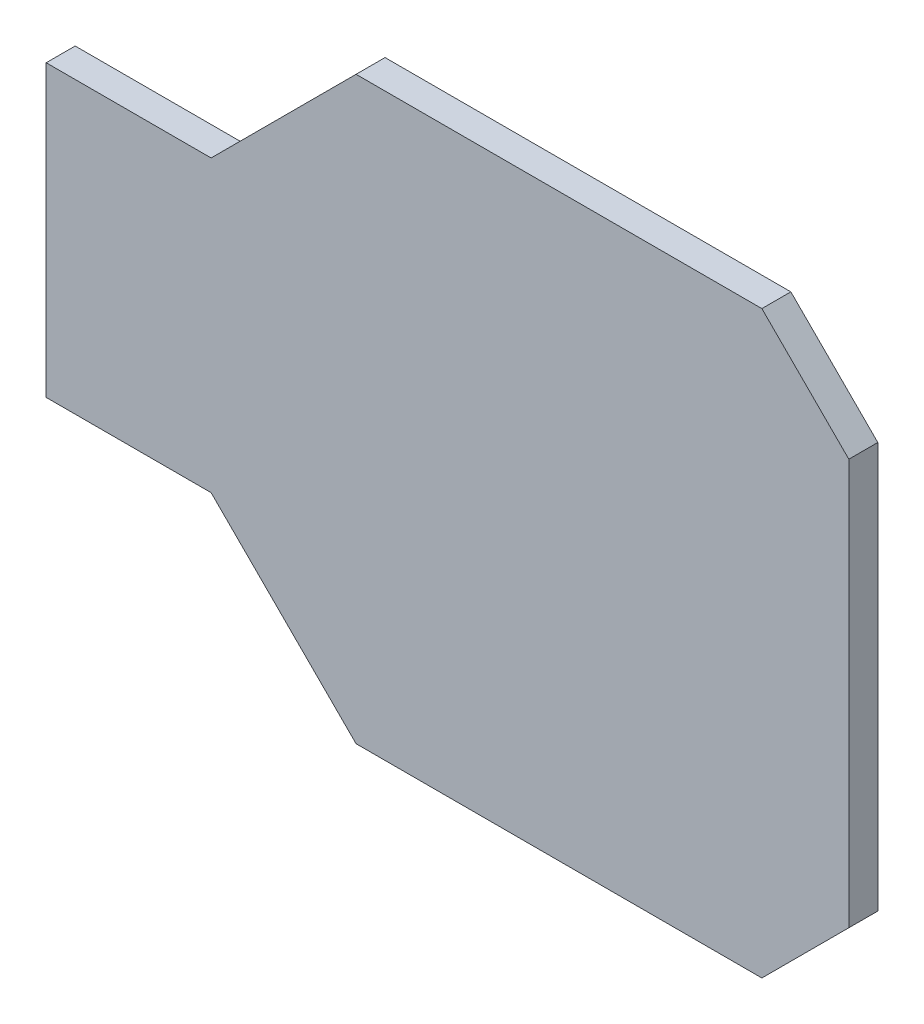
ISO-10303-21;
HEADER;
FILE_DESCRIPTION(('STEP AP214'),'2;1');
FILE_NAME('part.step','',(''),(''),'','','');
FILE_SCHEMA(('AUTOMOTIVE_DESIGN { 1 0 10303 214 1 1 1 1 }'));
ENDSEC;
DATA;
#1=APPLICATION_CONTEXT('core data for automotive mechanical design processes');
#2=APPLICATION_PROTOCOL_DEFINITION('international standard','automotive_design',2000,#1);
#3=PRODUCT_CONTEXT('',#1,'mechanical');
#4=PRODUCT('Part','Part','',(#3));
#5=PRODUCT_RELATED_PRODUCT_CATEGORY('part','',(#4));
#6=PRODUCT_DEFINITION_FORMATION('','',#4);
#7=PRODUCT_DEFINITION_CONTEXT('part definition',#1,'design');
#8=PRODUCT_DEFINITION('design','',#6,#7);
#9=PRODUCT_DEFINITION_SHAPE('','',#8);
#10=(LENGTH_UNIT() NAMED_UNIT(*) SI_UNIT(.MILLI.,.METRE.));
#11=(NAMED_UNIT(*) PLANE_ANGLE_UNIT() SI_UNIT($,.RADIAN.));
#12=(NAMED_UNIT(*) SI_UNIT($,.STERADIAN.) SOLID_ANGLE_UNIT());
#13=UNCERTAINTY_MEASURE_WITH_UNIT(LENGTH_MEASURE(1.E-05),#10,'distance_accuracy_value','');
#14=(GEOMETRIC_REPRESENTATION_CONTEXT(3) GLOBAL_UNCERTAINTY_ASSIGNED_CONTEXT((#13)) GLOBAL_UNIT_ASSIGNED_CONTEXT((#10,
#11,#12)) REPRESENTATION_CONTEXT('',''));
#15=CARTESIAN_POINT('',(0.,0.,0.));
#16=DIRECTION('',(0.,0.,1.));
#17=DIRECTION('',(1.,0.,0.));
#18=AXIS2_PLACEMENT_3D('',#15,#16,#17);
#19=CARTESIAN_POINT('',(0.,0.,0.1016));
#20=DIRECTION('',(0.,0.,1.));
#21=DIRECTION('',(1.,0.,0.));
#22=AXIS2_PLACEMENT_3D('',#19,#20,#21);
#23=PLANE('',#22);
#24=DIRECTION('',(1.,0.,0.));
#25=VECTOR('',#24,1.);
#26=CARTESIAN_POINT('',(0.677926,0.254,0.1016));
#27=LINE('',#26,#25);
#28=CARTESIAN_POINT('',(0.322326,0.254,0.1016));
#29=VERTEX_POINT('',#28);
#30=CARTESIAN_POINT('',(0.677926,0.254,0.1016));
#31=VERTEX_POINT('',#30);
#32=EDGE_CURVE('E106',#29,#31,#27,.T.);
#33=ORIENTED_EDGE('',*,*,#32,.F.);
#34=DIRECTION('',(-0.707106781186548,-0.707106781186548,0.));
#35=VECTOR('',#34,1.);
#36=CARTESIAN_POINT('',(0.322326,0.254,0.1016));
#37=LINE('',#36,#35);
#38=CARTESIAN_POINT('',(0.195326,0.127,0.1016));
#39=VERTEX_POINT('',#38);
#40=EDGE_CURVE('E20',#39,#29,#37,.F.);
#41=ORIENTED_EDGE('',*,*,#40,.F.);
#42=DIRECTION('',(1.,0.,0.));
#43=VECTOR('',#42,1.);
#44=CARTESIAN_POINT('',(0.195326,0.127,0.1016));
#45=LINE('',#44,#43);
#46=CARTESIAN_POINT('',(0.0508,0.127,0.1016));
#47=VERTEX_POINT('',#46);
#48=EDGE_CURVE('E95',#47,#39,#45,.T.);
#49=ORIENTED_EDGE('',*,*,#48,.F.);
#50=DIRECTION('',(0.,1.,0.));
#51=VECTOR('',#50,1.);
#52=CARTESIAN_POINT('',(0.0508,0.127,0.1016));
#53=LINE('',#52,#51);
#54=CARTESIAN_POINT('',(0.0508,-0.127,0.1016));
#55=VERTEX_POINT('',#54);
#56=EDGE_CURVE('E90',#55,#47,#53,.T.);
#57=ORIENTED_EDGE('',*,*,#56,.F.);
#58=DIRECTION('',(1.,0.,0.));
#59=VECTOR('',#58,1.);
#60=CARTESIAN_POINT('',(0.0508,-0.127,0.1016));
#61=LINE('',#60,#59);
#62=CARTESIAN_POINT('',(0.195326,-0.127,0.1016));
#63=VERTEX_POINT('',#62);
#64=EDGE_CURVE('E117',#63,#55,#61,.F.);
#65=ORIENTED_EDGE('',*,*,#64,.F.);
#66=DIRECTION('',(0.707106781186548,-0.707106781186548,0.));
#67=VECTOR('',#66,1.);
#68=CARTESIAN_POINT('',(0.195326,-0.127,0.1016));
#69=LINE('',#68,#67);
#70=CARTESIAN_POINT('',(0.322326,-0.254,0.1016));
#71=VERTEX_POINT('',#70);
#72=EDGE_CURVE('E121',#71,#63,#69,.F.);
#73=ORIENTED_EDGE('',*,*,#72,.F.);
#74=DIRECTION('',(1.,0.,0.));
#75=VECTOR('',#74,1.);
#76=CARTESIAN_POINT('',(0.322326,-0.254,0.1016));
#77=LINE('',#76,#75);
#78=CARTESIAN_POINT('',(0.677926,-0.254,0.1016));
#79=VERTEX_POINT('',#78);
#80=EDGE_CURVE('E125',#79,#71,#77,.F.);
#81=ORIENTED_EDGE('',*,*,#80,.F.);
#82=DIRECTION('',(0.707106781186548,0.707106781186548,0.));
#83=VECTOR('',#82,1.);
#84=CARTESIAN_POINT('',(0.677926,-0.254,0.1016));
#85=LINE('',#84,#83);
#86=CARTESIAN_POINT('',(0.754126,-0.1778,0.1016));
#87=VERTEX_POINT('',#86);
#88=EDGE_CURVE('E129',#87,#79,#85,.F.);
#89=ORIENTED_EDGE('',*,*,#88,.F.);
#90=DIRECTION('',(0.,1.,0.));
#91=VECTOR('',#90,1.);
#92=CARTESIAN_POINT('',(0.754126,-0.1778,0.1016));
#93=LINE('',#92,#91);
#94=CARTESIAN_POINT('',(0.754126,0.1778,0.1016));
#95=VERTEX_POINT('',#94);
#96=EDGE_CURVE('E133',#95,#87,#93,.F.);
#97=ORIENTED_EDGE('',*,*,#96,.F.);
#98=DIRECTION('',(-0.707106781186548,0.707106781186548,0.));
#99=VECTOR('',#98,1.);
#100=CARTESIAN_POINT('',(0.754126,0.1778,0.1016));
#101=LINE('',#100,#99);
#102=EDGE_CURVE('E137',#31,#95,#101,.F.);
#103=ORIENTED_EDGE('',*,*,#102,.F.);
#104=EDGE_LOOP('',(#33,#41,#49,#57,#65,#73,#81,#89,#97,#103));
#105=FACE_BOUND('',#104,.T.);
#106=ADVANCED_FACE('F17',(#105),#23,.T.);
#107=CARTESIAN_POINT('',(0.322326,0.254,0.0762));
#108=DIRECTION('',(-0.707106781186548,0.707106781186548,0.));
#109=DIRECTION('',(-0.707106781186548,-0.707106781186548,0.));
#110=AXIS2_PLACEMENT_3D('',#107,#108,#109);
#111=PLANE('',#110);
#112=DIRECTION('',(0.,0.,1.));
#113=VECTOR('',#112,1.);
#114=CARTESIAN_POINT('',(0.322326,0.254,0.0762));
#115=LINE('',#114,#113);
#116=CARTESIAN_POINT('',(0.322326,0.254,0.0762));
#117=VERTEX_POINT('',#116);
#118=EDGE_CURVE('E141',#117,#29,#115,.T.);
#119=ORIENTED_EDGE('',*,*,#118,.F.);
#120=DIRECTION('',(-0.707106781186548,-0.707106781186547,0.));
#121=VECTOR('',#120,1.);
#122=CARTESIAN_POINT('',(0.322326,0.254,0.0762));
#123=LINE('',#122,#121);
#124=CARTESIAN_POINT('',(0.195326,0.127,0.0762));
#125=VERTEX_POINT('',#124);
#126=EDGE_CURVE('E112',#117,#125,#123,.T.);
#127=ORIENTED_EDGE('',*,*,#126,.T.);
#128=DIRECTION('',(0.,0.,1.));
#129=VECTOR('',#128,1.);
#130=CARTESIAN_POINT('',(0.195326,0.127,0.0762));
#131=LINE('',#130,#129);
#132=EDGE_CURVE('E100',#39,#125,#131,.F.);
#133=ORIENTED_EDGE('',*,*,#132,.F.);
#134=ORIENTED_EDGE('',*,*,#40,.T.);
#135=EDGE_LOOP('',(#119,#127,#133,#134));
#136=FACE_BOUND('',#135,.T.);
#137=ADVANCED_FACE('F111',(#136),#111,.T.);
#138=CARTESIAN_POINT('',(0.195326,0.127,0.0762));
#139=DIRECTION('',(0.,1.,0.));
#140=DIRECTION('',(0.,0.,1.));
#141=AXIS2_PLACEMENT_3D('',#138,#139,#140);
#142=PLANE('',#141);
#143=ORIENTED_EDGE('',*,*,#132,.T.);
#144=DIRECTION('',(1.,0.,0.));
#145=VECTOR('',#144,1.);
#146=CARTESIAN_POINT('',(0.,0.127,0.0762));
#147=LINE('',#146,#145);
#148=CARTESIAN_POINT('',(0.0508,0.127,0.0762));
#149=VERTEX_POINT('',#148);
#150=EDGE_CURVE('E146',#125,#149,#147,.F.);
#151=ORIENTED_EDGE('',*,*,#150,.T.);
#152=DIRECTION('',(0.,0.,1.));
#153=VECTOR('',#152,1.);
#154=CARTESIAN_POINT('',(0.0508,0.127,0.0762));
#155=LINE('',#154,#153);
#156=EDGE_CURVE('E102',#47,#149,#155,.F.);
#157=ORIENTED_EDGE('',*,*,#156,.F.);
#158=ORIENTED_EDGE('',*,*,#48,.T.);
#159=EDGE_LOOP('',(#143,#151,#157,#158));
#160=FACE_BOUND('',#159,.T.);
#161=ADVANCED_FACE('F97',(#160),#142,.T.);
#162=CARTESIAN_POINT('',(0.0508,0.127,0.0762));
#163=DIRECTION('',(-1.,0.,0.));
#164=DIRECTION('',(0.,0.,1.));
#165=AXIS2_PLACEMENT_3D('',#162,#163,#164);
#166=PLANE('',#165);
#167=ORIENTED_EDGE('',*,*,#156,.T.);
#168=DIRECTION('',(0.,1.,0.));
#169=VECTOR('',#168,1.);
#170=CARTESIAN_POINT('',(0.0508,0.,0.0762));
#171=LINE('',#170,#169);
#172=CARTESIAN_POINT('',(0.0508,-0.127,0.0762));
#173=VERTEX_POINT('',#172);
#174=EDGE_CURVE('E148',#149,#173,#171,.F.);
#175=ORIENTED_EDGE('',*,*,#174,.T.);
#176=DIRECTION('',(0.,0.,-1.));
#177=VECTOR('',#176,1.);
#178=CARTESIAN_POINT('',(0.0508,-0.127,0.0762));
#179=LINE('',#178,#177);
#180=EDGE_CURVE('E119',#55,#173,#179,.T.);
#181=ORIENTED_EDGE('',*,*,#180,.F.);
#182=ORIENTED_EDGE('',*,*,#56,.T.);
#183=EDGE_LOOP('',(#167,#175,#181,#182));
#184=FACE_BOUND('',#183,.T.);
#185=ADVANCED_FACE('F198',(#184),#166,.T.);
#186=CARTESIAN_POINT('',(0.0508,-0.127,0.0762));
#187=DIRECTION('',(0.,-1.,0.));
#188=DIRECTION('',(0.,0.,-1.));
#189=AXIS2_PLACEMENT_3D('',#186,#187,#188);
#190=PLANE('',#189);
#191=ORIENTED_EDGE('',*,*,#180,.T.);
#192=DIRECTION('',(1.,0.,0.));
#193=VECTOR('',#192,1.);
#194=CARTESIAN_POINT('',(0.,-0.127,0.0762));
#195=LINE('',#194,#193);
#196=CARTESIAN_POINT('',(0.195326,-0.127,0.0762));
#197=VERTEX_POINT('',#196);
#198=EDGE_CURVE('E151',#173,#197,#195,.T.);
#199=ORIENTED_EDGE('',*,*,#198,.T.);
#200=DIRECTION('',(0.,0.,1.));
#201=VECTOR('',#200,1.);
#202=CARTESIAN_POINT('',(0.195326,-0.127,0.0762));
#203=LINE('',#202,#201);
#204=EDGE_CURVE('E123',#63,#197,#203,.F.);
#205=ORIENTED_EDGE('',*,*,#204,.F.);
#206=ORIENTED_EDGE('',*,*,#64,.T.);
#207=EDGE_LOOP('',(#191,#199,#205,#206));
#208=FACE_BOUND('',#207,.T.);
#209=ADVANCED_FACE('F197',(#208),#190,.T.);
#210=CARTESIAN_POINT('',(0.195326,-0.127,0.0762));
#211=DIRECTION('',(-0.707106781186548,-0.707106781186548,0.));
#212=DIRECTION('',(0.707106781186548,-0.707106781186548,0.));
#213=AXIS2_PLACEMENT_3D('',#210,#211,#212);
#214=PLANE('',#213);
#215=ORIENTED_EDGE('',*,*,#204,.T.);
#216=DIRECTION('',(0.707106781186548,-0.707106781186547,0.));
#217=VECTOR('',#216,1.);
#218=CARTESIAN_POINT('',(0.195326,-0.127,0.0762));
#219=LINE('',#218,#217);
#220=CARTESIAN_POINT('',(0.322326,-0.254,0.0762));
#221=VERTEX_POINT('',#220);
#222=EDGE_CURVE('E154',#197,#221,#219,.T.);
#223=ORIENTED_EDGE('',*,*,#222,.T.);
#224=DIRECTION('',(0.,0.,-1.));
#225=VECTOR('',#224,1.);
#226=CARTESIAN_POINT('',(0.322326,-0.254,0.0762));
#227=LINE('',#226,#225);
#228=EDGE_CURVE('E127',#71,#221,#227,.T.);
#229=ORIENTED_EDGE('',*,*,#228,.F.);
#230=ORIENTED_EDGE('',*,*,#72,.T.);
#231=EDGE_LOOP('',(#215,#223,#229,#230));
#232=FACE_BOUND('',#231,.T.);
#233=ADVANCED_FACE('F191',(#232),#214,.T.);
#234=CARTESIAN_POINT('',(0.322326,-0.254,0.0762));
#235=DIRECTION('',(0.,-1.,0.));
#236=DIRECTION('',(0.,0.,-1.));
#237=AXIS2_PLACEMENT_3D('',#234,#235,#236);
#238=PLANE('',#237);
#239=ORIENTED_EDGE('',*,*,#228,.T.);
#240=DIRECTION('',(1.,0.,0.));
#241=VECTOR('',#240,1.);
#242=CARTESIAN_POINT('',(0.,-0.254,0.0762));
#243=LINE('',#242,#241);
#244=CARTESIAN_POINT('',(0.677926,-0.254,0.0762));
#245=VERTEX_POINT('',#244);
#246=EDGE_CURVE('E157',#221,#245,#243,.T.);
#247=ORIENTED_EDGE('',*,*,#246,.T.);
#248=DIRECTION('',(0.,0.,1.));
#249=VECTOR('',#248,1.);
#250=CARTESIAN_POINT('',(0.677926,-0.254,0.0762));
#251=LINE('',#250,#249);
#252=EDGE_CURVE('E131',#79,#245,#251,.F.);
#253=ORIENTED_EDGE('',*,*,#252,.F.);
#254=ORIENTED_EDGE('',*,*,#80,.T.);
#255=EDGE_LOOP('',(#239,#247,#253,#254));
#256=FACE_BOUND('',#255,.T.);
#257=ADVANCED_FACE('F187',(#256),#238,.T.);
#258=CARTESIAN_POINT('',(0.677926,-0.254,0.0762));
#259=DIRECTION('',(0.707106781186548,-0.707106781186548,0.));
#260=DIRECTION('',(0.707106781186548,0.707106781186548,0.));
#261=AXIS2_PLACEMENT_3D('',#258,#259,#260);
#262=PLANE('',#261);
#263=ORIENTED_EDGE('',*,*,#252,.T.);
#264=DIRECTION('',(0.707106781186548,0.707106781186547,0.));
#265=VECTOR('',#264,1.);
#266=CARTESIAN_POINT('',(0.677926,-0.254,0.0762));
#267=LINE('',#266,#265);
#268=CARTESIAN_POINT('',(0.754126,-0.1778,0.0762));
#269=VERTEX_POINT('',#268);
#270=EDGE_CURVE('E160',#245,#269,#267,.T.);
#271=ORIENTED_EDGE('',*,*,#270,.T.);
#272=DIRECTION('',(0.,0.,-1.));
#273=VECTOR('',#272,1.);
#274=CARTESIAN_POINT('',(0.754126,-0.1778,0.0762));
#275=LINE('',#274,#273);
#276=EDGE_CURVE('E135',#87,#269,#275,.T.);
#277=ORIENTED_EDGE('',*,*,#276,.F.);
#278=ORIENTED_EDGE('',*,*,#88,.T.);
#279=EDGE_LOOP('',(#263,#271,#277,#278));
#280=FACE_BOUND('',#279,.T.);
#281=ADVANCED_FACE('F181',(#280),#262,.T.);
#282=CARTESIAN_POINT('',(0.754126,-0.1778,0.0762));
#283=DIRECTION('',(1.,0.,0.));
#284=DIRECTION('',(0.,0.,-1.));
#285=AXIS2_PLACEMENT_3D('',#282,#283,#284);
#286=PLANE('',#285);
#287=ORIENTED_EDGE('',*,*,#276,.T.);
#288=DIRECTION('',(0.,1.,0.));
#289=VECTOR('',#288,1.);
#290=CARTESIAN_POINT('',(0.754126,0.,0.0762));
#291=LINE('',#290,#289);
#292=CARTESIAN_POINT('',(0.754126,0.1778,0.0762));
#293=VERTEX_POINT('',#292);
#294=EDGE_CURVE('E163',#269,#293,#291,.T.);
#295=ORIENTED_EDGE('',*,*,#294,.T.);
#296=DIRECTION('',(0.,0.,1.));
#297=VECTOR('',#296,1.);
#298=CARTESIAN_POINT('',(0.754126,0.1778,0.0762));
#299=LINE('',#298,#297);
#300=EDGE_CURVE('E139',#95,#293,#299,.F.);
#301=ORIENTED_EDGE('',*,*,#300,.F.);
#302=ORIENTED_EDGE('',*,*,#96,.T.);
#303=EDGE_LOOP('',(#287,#295,#301,#302));
#304=FACE_BOUND('',#303,.T.);
#305=ADVANCED_FACE('F176',(#304),#286,.T.);
#306=CARTESIAN_POINT('',(0.754126,0.1778,0.0762));
#307=DIRECTION('',(0.707106781186548,0.707106781186548,0.));
#308=DIRECTION('',(-0.707106781186548,0.707106781186548,0.));
#309=AXIS2_PLACEMENT_3D('',#306,#307,#308);
#310=PLANE('',#309);
#311=ORIENTED_EDGE('',*,*,#300,.T.);
#312=DIRECTION('',(-0.707106781186548,0.707106781186547,0.));
#313=VECTOR('',#312,1.);
#314=CARTESIAN_POINT('',(0.754126,0.1778,0.0762));
#315=LINE('',#314,#313);
#316=CARTESIAN_POINT('',(0.677926,0.254,0.0762));
#317=VERTEX_POINT('',#316);
#318=EDGE_CURVE('E26',#293,#317,#315,.T.);
#319=ORIENTED_EDGE('',*,*,#318,.T.);
#320=DIRECTION('',(0.,0.,1.));
#321=VECTOR('',#320,1.);
#322=CARTESIAN_POINT('',(0.677926,0.254,0.0762));
#323=LINE('',#322,#321);
#324=EDGE_CURVE('E34',#31,#317,#323,.F.);
#325=ORIENTED_EDGE('',*,*,#324,.F.);
#326=ORIENTED_EDGE('',*,*,#102,.T.);
#327=EDGE_LOOP('',(#311,#319,#325,#326));
#328=FACE_BOUND('',#327,.T.);
#329=ADVANCED_FACE('F169',(#328),#310,.T.);
#330=CARTESIAN_POINT('',(0.677926,0.254,0.0762));
#331=DIRECTION('',(0.,1.,0.));
#332=DIRECTION('',(0.,0.,1.));
#333=AXIS2_PLACEMENT_3D('',#330,#331,#332);
#334=PLANE('',#333);
#335=ORIENTED_EDGE('',*,*,#324,.T.);
#336=DIRECTION('',(1.,0.,0.));
#337=VECTOR('',#336,1.);
#338=CARTESIAN_POINT('',(0.,0.254,0.0762));
#339=LINE('',#338,#337);
#340=EDGE_CURVE('E11',#317,#117,#339,.F.);
#341=ORIENTED_EDGE('',*,*,#340,.T.);
#342=ORIENTED_EDGE('',*,*,#118,.T.);
#343=ORIENTED_EDGE('',*,*,#32,.T.);
#344=EDGE_LOOP('',(#335,#341,#342,#343));
#345=FACE_BOUND('',#344,.T.);
#346=ADVANCED_FACE('F199',(#345),#334,.T.);
#347=CARTESIAN_POINT('',(0.,0.,0.0762));
#348=DIRECTION('',(0.,0.,1.));
#349=DIRECTION('',(1.,0.,0.));
#350=AXIS2_PLACEMENT_3D('',#347,#348,#349);
#351=PLANE('',#350);
#352=ORIENTED_EDGE('',*,*,#318,.F.);
#353=ORIENTED_EDGE('',*,*,#294,.F.);
#354=ORIENTED_EDGE('',*,*,#270,.F.);
#355=ORIENTED_EDGE('',*,*,#246,.F.);
#356=ORIENTED_EDGE('',*,*,#222,.F.);
#357=ORIENTED_EDGE('',*,*,#198,.F.);
#358=ORIENTED_EDGE('',*,*,#174,.F.);
#359=ORIENTED_EDGE('',*,*,#150,.F.);
#360=ORIENTED_EDGE('',*,*,#126,.F.);
#361=ORIENTED_EDGE('',*,*,#340,.F.);
#362=EDGE_LOOP('',(#352,#353,#354,#355,#356,#357,#358,#359,#360,#361));
#363=FACE_BOUND('',#362,.T.);
#364=ADVANCED_FACE('F173',(#363),#351,.F.);
#365=CLOSED_SHELL('',(#106,#137,#161,#185,#209,#233,#257,#281,#305,#329,#346,#364));
#366=MANIFOLD_SOLID_BREP('B1',#365);
#367=ADVANCED_BREP_SHAPE_REPRESENTATION('',(#18,#366),#14);
#368=SHAPE_DEFINITION_REPRESENTATION(#9,#367);
ENDSEC;
END-ISO-10303-21;
